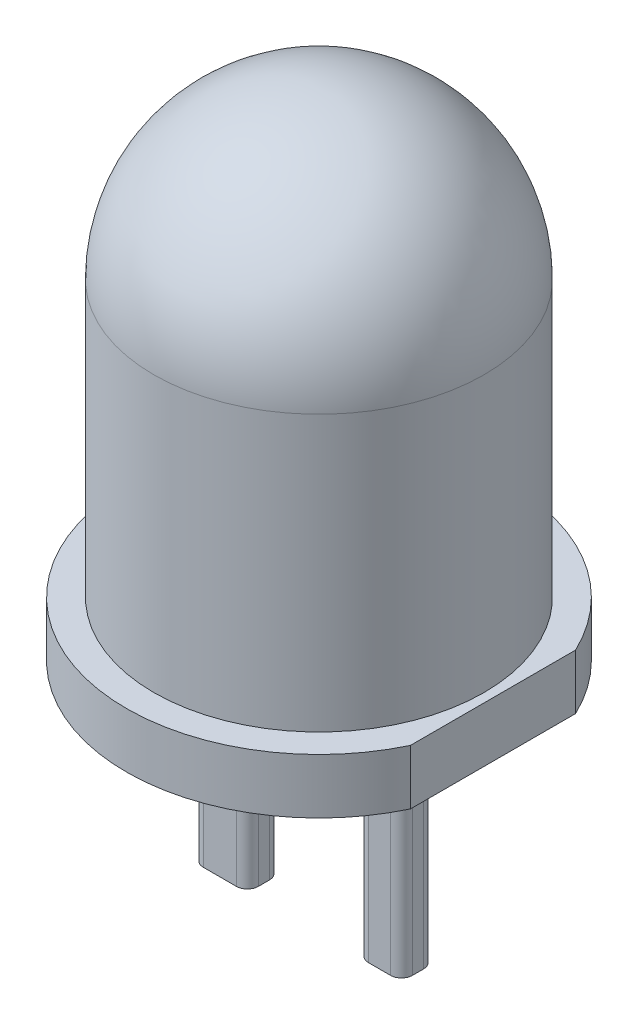
ISO-10303-21;
HEADER;
FILE_DESCRIPTION(('STEP AP214'),'2;1');
FILE_NAME('part.step','',(''),(''),'','','');
FILE_SCHEMA(('AUTOMOTIVE_DESIGN { 1 0 10303 214 1 1 1 1 }'));
ENDSEC;
DATA;
#1=APPLICATION_CONTEXT('core data for automotive mechanical design processes');
#2=APPLICATION_PROTOCOL_DEFINITION('international standard','automotive_design',2000,#1);
#3=PRODUCT_CONTEXT('',#1,'mechanical');
#4=PRODUCT('Part','Part','',(#3));
#5=PRODUCT_RELATED_PRODUCT_CATEGORY('part','',(#4));
#6=PRODUCT_DEFINITION_FORMATION('','',#4);
#7=PRODUCT_DEFINITION_CONTEXT('part definition',#1,'design');
#8=PRODUCT_DEFINITION('design','',#6,#7);
#9=PRODUCT_DEFINITION_SHAPE('','',#8);
#10=(LENGTH_UNIT() NAMED_UNIT(*) SI_UNIT(.MILLI.,.METRE.));
#11=(NAMED_UNIT(*) PLANE_ANGLE_UNIT() SI_UNIT($,.RADIAN.));
#12=(NAMED_UNIT(*) SI_UNIT($,.STERADIAN.) SOLID_ANGLE_UNIT());
#13=UNCERTAINTY_MEASURE_WITH_UNIT(LENGTH_MEASURE(1.E-05),#10,'distance_accuracy_value','');
#14=(GEOMETRIC_REPRESENTATION_CONTEXT(3) GLOBAL_UNCERTAINTY_ASSIGNED_CONTEXT((#13)) GLOBAL_UNIT_ASSIGNED_CONTEXT((#10,
#11,#12)) REPRESENTATION_CONTEXT('',''));
#15=CARTESIAN_POINT('',(0.,0.,0.));
#16=DIRECTION('',(0.,0.,1.));
#17=DIRECTION('',(1.,0.,0.));
#18=AXIS2_PLACEMENT_3D('',#15,#16,#17);
#19=CARTESIAN_POINT('',(0.,0.,0.));
#20=DIRECTION('',(0.,1.,0.));
#21=DIRECTION('',(0.,0.,1.));
#22=AXIS2_PLACEMENT_3D('',#19,#20,#21);
#23=PLANE('',#22);
#24=CARTESIAN_POINT('',(0.8,0.,0.05));
#25=DIRECTION('',(0.,-1.,0.));
#26=DIRECTION('',(0.,0.,1.));
#27=AXIS2_PLACEMENT_3D('',#24,#25,#26);
#28=CIRCLE('',#27,0.1);
#29=CARTESIAN_POINT('',(0.9,0.,0.0499999999999993));
#30=VERTEX_POINT('',#29);
#31=CARTESIAN_POINT('',(0.799999999999999,0.,0.15));
#32=VERTEX_POINT('',#31);
#33=EDGE_CURVE('E181',#30,#32,#28,.T.);
#34=ORIENTED_EDGE('',*,*,#33,.F.);
#35=DIRECTION('',(0.,0.,1.));
#36=VECTOR('',#35,1.);
#37=CARTESIAN_POINT('',(0.9,0.,0.0499999999999993));
#38=LINE('',#37,#36);
#39=CARTESIAN_POINT('',(0.9,0.,-0.0499999999999993));
#40=VERTEX_POINT('',#39);
#41=EDGE_CURVE('E194',#40,#30,#38,.T.);
#42=ORIENTED_EDGE('',*,*,#41,.F.);
#43=CARTESIAN_POINT('',(0.8,0.,-0.05));
#44=DIRECTION('',(0.,-1.,0.));
#45=DIRECTION('',(0.,0.,-1.));
#46=AXIS2_PLACEMENT_3D('',#43,#44,#45);
#47=CIRCLE('',#46,0.1);
#48=CARTESIAN_POINT('',(0.799999999999999,0.,-0.15));
#49=VERTEX_POINT('',#48);
#50=EDGE_CURVE('E223',#49,#40,#47,.T.);
#51=ORIENTED_EDGE('',*,*,#50,.F.);
#52=DIRECTION('',(1.,0.,0.));
#53=VECTOR('',#52,1.);
#54=CARTESIAN_POINT('',(0.600000000000001,0.,-0.15));
#55=LINE('',#54,#53);
#56=CARTESIAN_POINT('',(0.600000000000001,0.,-0.15));
#57=VERTEX_POINT('',#56);
#58=EDGE_CURVE('E220',#57,#49,#55,.T.);
#59=ORIENTED_EDGE('',*,*,#58,.F.);
#60=CARTESIAN_POINT('',(0.6,0.,-0.05));
#61=DIRECTION('',(0.,-1.,0.));
#62=DIRECTION('',(0.,0.,-1.));
#63=AXIS2_PLACEMENT_3D('',#60,#61,#62);
#64=CIRCLE('',#63,0.1);
#65=CARTESIAN_POINT('',(0.5,0.,-0.0499999999999993));
#66=VERTEX_POINT('',#65);
#67=EDGE_CURVE('E217',#66,#57,#64,.T.);
#68=ORIENTED_EDGE('',*,*,#67,.F.);
#69=DIRECTION('',(0.,0.,-1.));
#70=VECTOR('',#69,1.);
#71=CARTESIAN_POINT('',(0.5,0.,0.0499999999999993));
#72=LINE('',#71,#70);
#73=CARTESIAN_POINT('',(0.5,0.,0.0499999999999993));
#74=VERTEX_POINT('',#73);
#75=EDGE_CURVE('E214',#74,#66,#72,.T.);
#76=ORIENTED_EDGE('',*,*,#75,.F.);
#77=CARTESIAN_POINT('',(0.6,0.,0.05));
#78=DIRECTION('',(0.,-1.,0.));
#79=DIRECTION('',(0.,0.,-1.));
#80=AXIS2_PLACEMENT_3D('',#77,#78,#79);
#81=CIRCLE('',#80,0.1);
#82=CARTESIAN_POINT('',(0.6,0.,0.15));
#83=VERTEX_POINT('',#82);
#84=EDGE_CURVE('E211',#83,#74,#81,.T.);
#85=ORIENTED_EDGE('',*,*,#84,.F.);
#86=DIRECTION('',(-1.,0.,0.));
#87=VECTOR('',#86,1.);
#88=CARTESIAN_POINT('',(0.600000000000001,0.,0.15));
#89=LINE('',#88,#87);
#90=EDGE_CURVE('E184',#32,#83,#89,.T.);
#91=ORIENTED_EDGE('',*,*,#90,.F.);
#92=EDGE_LOOP('',(#34,#42,#51,#59,#68,#76,#85,#91));
#93=FACE_BOUND('',#92,.T.);
#94=CARTESIAN_POINT('',(0.,0.,0.));
#95=DIRECTION('',(0.,-1.,0.));
#96=DIRECTION('',(0.,0.,-1.));
#97=AXIS2_PLACEMENT_3D('',#94,#95,#96);
#98=CIRCLE('',#97,1.75);
#99=CARTESIAN_POINT('',(1.58113883008419,0.,0.75));
#100=VERTEX_POINT('',#99);
#101=CARTESIAN_POINT('',(1.58113883008419,0.,-0.75));
#102=VERTEX_POINT('',#101);
#103=EDGE_CURVE('E43',#100,#102,#98,.T.);
#104=ORIENTED_EDGE('',*,*,#103,.T.);
#105=DIRECTION('',(0.,0.,-1.));
#106=VECTOR('',#105,1.);
#107=CARTESIAN_POINT('',(1.58113883008419,0.,-0.75));
#108=LINE('',#107,#106);
#109=EDGE_CURVE('E251',#100,#102,#108,.T.);
#110=ORIENTED_EDGE('',*,*,#109,.F.);
#111=EDGE_LOOP('',(#104,#110));
#112=FACE_BOUND('',#111,.T.);
#113=CARTESIAN_POINT('',(-0.6,0.,-0.05));
#114=DIRECTION('',(0.,-1.,0.));
#115=DIRECTION('',(0.,0.,-1.));
#116=AXIS2_PLACEMENT_3D('',#113,#114,#115);
#117=CIRCLE('',#116,0.1);
#118=CARTESIAN_POINT('',(-0.600000000000001,0.,-0.15));
#119=VERTEX_POINT('',#118);
#120=CARTESIAN_POINT('',(-0.5,0.,-0.0499999999999993));
#121=VERTEX_POINT('',#120);
#122=EDGE_CURVE('E180',#119,#121,#117,.T.);
#123=ORIENTED_EDGE('',*,*,#122,.F.);
#124=DIRECTION('',(1.,0.,0.));
#125=VECTOR('',#124,1.);
#126=CARTESIAN_POINT('',(-0.899999999999999,0.,-0.15));
#127=LINE('',#126,#125);
#128=CARTESIAN_POINT('',(-0.899999999999999,0.,-0.15));
#129=VERTEX_POINT('',#128);
#130=EDGE_CURVE('E177',#129,#119,#127,.T.);
#131=ORIENTED_EDGE('',*,*,#130,.F.);
#132=CARTESIAN_POINT('',(-0.9,0.,-0.05));
#133=DIRECTION('',(0.,-1.,0.));
#134=DIRECTION('',(0.,0.,-1.));
#135=AXIS2_PLACEMENT_3D('',#132,#133,#134);
#136=CIRCLE('',#135,0.1);
#137=CARTESIAN_POINT('',(-1.,0.,-0.0499999999999993));
#138=VERTEX_POINT('',#137);
#139=EDGE_CURVE('E536',#138,#129,#136,.T.);
#140=ORIENTED_EDGE('',*,*,#139,.F.);
#141=DIRECTION('',(0.,0.,-1.));
#142=VECTOR('',#141,1.);
#143=CARTESIAN_POINT('',(-1.,0.,0.0499999999999993));
#144=LINE('',#143,#142);
#145=CARTESIAN_POINT('',(-1.,0.,0.0499999999999993));
#146=VERTEX_POINT('',#145);
#147=EDGE_CURVE('E567',#146,#138,#144,.T.);
#148=ORIENTED_EDGE('',*,*,#147,.F.);
#149=CARTESIAN_POINT('',(-0.9,0.,0.05));
#150=DIRECTION('',(0.,-1.,0.));
#151=DIRECTION('',(0.,0.,-1.));
#152=AXIS2_PLACEMENT_3D('',#149,#150,#151);
#153=CIRCLE('',#152,0.1);
#154=CARTESIAN_POINT('',(-0.9,0.,0.15));
#155=VERTEX_POINT('',#154);
#156=EDGE_CURVE('E560',#155,#146,#153,.T.);
#157=ORIENTED_EDGE('',*,*,#156,.F.);
#158=DIRECTION('',(-1.,0.,0.));
#159=VECTOR('',#158,1.);
#160=CARTESIAN_POINT('',(-0.899999999999999,0.,0.15));
#161=LINE('',#160,#159);
#162=CARTESIAN_POINT('',(-0.600000000000001,0.,0.15));
#163=VERTEX_POINT('',#162);
#164=EDGE_CURVE('E557',#163,#155,#161,.T.);
#165=ORIENTED_EDGE('',*,*,#164,.F.);
#166=CARTESIAN_POINT('',(-0.6,0.,0.05));
#167=DIRECTION('',(0.,-1.,0.));
#168=DIRECTION('',(0.,0.,1.));
#169=AXIS2_PLACEMENT_3D('',#166,#167,#168);
#170=CIRCLE('',#169,0.1);
#171=CARTESIAN_POINT('',(-0.5,0.,0.0499999999999993));
#172=VERTEX_POINT('',#171);
#173=EDGE_CURVE('E55',#172,#163,#170,.T.);
#174=ORIENTED_EDGE('',*,*,#173,.F.);
#175=DIRECTION('',(0.,0.,1.));
#176=VECTOR('',#175,1.);
#177=CARTESIAN_POINT('',(-0.5,0.,0.0499999999999993));
#178=LINE('',#177,#176);
#179=EDGE_CURVE('E50',#121,#172,#178,.T.);
#180=ORIENTED_EDGE('',*,*,#179,.F.);
#181=EDGE_LOOP('',(#123,#131,#140,#148,#157,#165,#174,#180));
#182=FACE_BOUND('',#181,.T.);
#183=ADVANCED_FACE('F36',(#93,#112,#182),#23,.F.);
#184=CARTESIAN_POINT('',(0.,0.,0.));
#185=DIRECTION('',(0.,-1.,0.));
#186=DIRECTION('',(0.,0.,-1.));
#187=AXIS2_PLACEMENT_3D('',#184,#185,#186);
#188=CYLINDRICAL_SURFACE('',#187,1.75);
#189=CARTESIAN_POINT('',(0.,0.5,0.));
#190=DIRECTION('',(0.,-1.,0.));
#191=DIRECTION('',(0.,0.,-1.));
#192=AXIS2_PLACEMENT_3D('',#189,#190,#191);
#193=CIRCLE('',#192,1.75);
#194=CARTESIAN_POINT('',(1.58113883008419,0.5,0.75));
#195=VERTEX_POINT('',#194);
#196=CARTESIAN_POINT('',(1.58113883008419,0.5,-0.75));
#197=VERTEX_POINT('',#196);
#198=EDGE_CURVE('E264',#195,#197,#193,.T.);
#199=ORIENTED_EDGE('',*,*,#198,.T.);
#200=DIRECTION('',(0.,-1.,0.));
#201=VECTOR('',#200,1.);
#202=CARTESIAN_POINT('',(1.58113883008419,1.,-0.75));
#203=LINE('',#202,#201);
#204=EDGE_CURVE('E254',#197,#102,#203,.T.);
#205=ORIENTED_EDGE('',*,*,#204,.T.);
#206=ORIENTED_EDGE('',*,*,#103,.F.);
#207=DIRECTION('',(0.,-1.,0.));
#208=VECTOR('',#207,1.);
#209=CARTESIAN_POINT('',(1.58113883008419,1.,0.75));
#210=LINE('',#209,#208);
#211=EDGE_CURVE('E253',#195,#100,#210,.T.);
#212=ORIENTED_EDGE('',*,*,#211,.F.);
#213=EDGE_LOOP('',(#199,#205,#206,#212));
#214=FACE_BOUND('',#213,.T.);
#215=ADVANCED_FACE('F272',(#214),#188,.T.);
#216=CARTESIAN_POINT('',(-1.75,0.5,0.));
#217=DIRECTION('',(0.,-1.,0.));
#218=DIRECTION('',(0.,0.,-1.));
#219=AXIS2_PLACEMENT_3D('',#216,#217,#218);
#220=PLANE('',#219);
#221=ORIENTED_EDGE('',*,*,#198,.F.);
#222=DIRECTION('',(0.,0.,-1.));
#223=VECTOR('',#222,1.);
#224=CARTESIAN_POINT('',(1.58113883008419,0.5,0.));
#225=LINE('',#224,#223);
#226=EDGE_CURVE('E11',#195,#197,#225,.T.);
#227=ORIENTED_EDGE('',*,*,#226,.T.);
#228=EDGE_LOOP('',(#221,#227));
#229=FACE_BOUND('',#228,.T.);
#230=CARTESIAN_POINT('',(0.,0.5,0.));
#231=DIRECTION('',(0.,-1.,0.));
#232=DIRECTION('',(0.,0.,-1.));
#233=AXIS2_PLACEMENT_3D('',#230,#231,#232);
#234=CIRCLE('',#233,1.5);
#235=CARTESIAN_POINT('',(0.,0.5,-1.5));
#236=VERTEX_POINT('',#235);
#237=EDGE_CURVE('E261',#236,#236,#234,.T.);
#238=ORIENTED_EDGE('',*,*,#237,.T.);
#239=EDGE_LOOP('',(#238));
#240=FACE_BOUND('',#239,.T.);
#241=ADVANCED_FACE('F277',(#229,#240),#220,.F.);
#242=CARTESIAN_POINT('',(0.,0.,0.));
#243=DIRECTION('',(0.,-1.,0.));
#244=DIRECTION('',(0.,0.,-1.));
#245=AXIS2_PLACEMENT_3D('',#242,#243,#244);
#246=CYLINDRICAL_SURFACE('',#245,1.5);
#247=ORIENTED_EDGE('',*,*,#237,.F.);
#248=EDGE_LOOP('',(#247));
#249=FACE_BOUND('',#248,.T.);
#250=CARTESIAN_POINT('',(0.,3.00000000000001,0.));
#251=DIRECTION('',(0.,-1.,0.));
#252=DIRECTION('',(0.,0.,-1.));
#253=AXIS2_PLACEMENT_3D('',#250,#251,#252);
#254=CIRCLE('',#253,1.5);
#255=CARTESIAN_POINT('',(0.,3.00000000000001,-1.5));
#256=VERTEX_POINT('',#255);
#257=EDGE_CURVE('E257',#256,#256,#254,.T.);
#258=ORIENTED_EDGE('',*,*,#257,.T.);
#259=EDGE_LOOP('',(#258));
#260=FACE_BOUND('',#259,.T.);
#261=ADVANCED_FACE('F280',(#249,#260),#246,.T.);
#262=CARTESIAN_POINT('',(0.,3.00000000000001,0.));
#263=DIRECTION('',(0.,-1.,0.));
#264=DIRECTION('',(1.,0.,0.));
#265=AXIS2_PLACEMENT_3D('',#262,#263,#264);
#266=SPHERICAL_SURFACE('',#265,1.49999999999999);
#267=ORIENTED_EDGE('',*,*,#257,.F.);
#268=EDGE_LOOP('',(#267));
#269=FACE_BOUND('',#268,.T.);
#270=ADVANCED_FACE('F286',(#269),#266,.T.);
#271=CARTESIAN_POINT('',(1.58113883008419,1.,-0.75));
#272=DIRECTION('',(-1.,0.,0.));
#273=DIRECTION('',(0.,0.,1.));
#274=AXIS2_PLACEMENT_3D('',#271,#272,#273);
#275=PLANE('',#274);
#276=ORIENTED_EDGE('',*,*,#211,.T.);
#277=ORIENTED_EDGE('',*,*,#109,.T.);
#278=ORIENTED_EDGE('',*,*,#204,.F.);
#279=ORIENTED_EDGE('',*,*,#226,.F.);
#280=EDGE_LOOP('',(#276,#277,#278,#279));
#281=FACE_BOUND('',#280,.T.);
#282=ADVANCED_FACE('F275',(#281),#275,.F.);
#283=CARTESIAN_POINT('',(0.8,-2.,0.05));
#284=DIRECTION('',(0.,1.,0.));
#285=DIRECTION('',(0.,0.,1.));
#286=AXIS2_PLACEMENT_3D('',#283,#284,#285);
#287=CYLINDRICAL_SURFACE('',#286,0.1);
#288=ORIENTED_EDGE('',*,*,#33,.T.);
#289=DIRECTION('',(0.,1.,0.));
#290=VECTOR('',#289,1.);
#291=CARTESIAN_POINT('',(0.799999999999999,-2.,0.15));
#292=LINE('',#291,#290);
#293=CARTESIAN_POINT('',(0.799999999999999,-2.,0.15));
#294=VERTEX_POINT('',#293);
#295=EDGE_CURVE('E248',#294,#32,#292,.T.);
#296=ORIENTED_EDGE('',*,*,#295,.F.);
#297=CARTESIAN_POINT('',(0.8,-2.,0.05));
#298=DIRECTION('',(0.,-1.,0.));
#299=DIRECTION('',(0.,0.,1.));
#300=AXIS2_PLACEMENT_3D('',#297,#298,#299);
#301=CIRCLE('',#300,0.1);
#302=CARTESIAN_POINT('',(0.9,-2.,0.0499999999999993));
#303=VERTEX_POINT('',#302);
#304=EDGE_CURVE('E190',#303,#294,#301,.T.);
#305=ORIENTED_EDGE('',*,*,#304,.F.);
#306=DIRECTION('',(0.,1.,0.));
#307=VECTOR('',#306,1.);
#308=CARTESIAN_POINT('',(0.9,-2.,0.0499999999999993));
#309=LINE('',#308,#307);
#310=EDGE_CURVE('E207',#303,#30,#309,.T.);
#311=ORIENTED_EDGE('',*,*,#310,.T.);
#312=EDGE_LOOP('',(#288,#296,#305,#311));
#313=FACE_BOUND('',#312,.T.);
#314=ADVANCED_FACE('F295',(#313),#287,.T.);
#315=CARTESIAN_POINT('',(0.600000000000001,-2.,0.15));
#316=DIRECTION('',(0.,0.,-1.));
#317=DIRECTION('',(-1.,0.,0.));
#318=AXIS2_PLACEMENT_3D('',#315,#316,#317);
#319=PLANE('',#318);
#320=ORIENTED_EDGE('',*,*,#90,.T.);
#321=DIRECTION('',(0.,1.,0.));
#322=VECTOR('',#321,1.);
#323=CARTESIAN_POINT('',(0.600000000000001,-2.,0.15));
#324=LINE('',#323,#322);
#325=CARTESIAN_POINT('',(0.600000000000001,-2.,0.15));
#326=VERTEX_POINT('',#325);
#327=EDGE_CURVE('E245',#326,#83,#324,.T.);
#328=ORIENTED_EDGE('',*,*,#327,.F.);
#329=DIRECTION('',(-1.,0.,0.));
#330=VECTOR('',#329,1.);
#331=CARTESIAN_POINT('',(0.600000000000001,-2.,0.15));
#332=LINE('',#331,#330);
#333=EDGE_CURVE('E193',#294,#326,#332,.T.);
#334=ORIENTED_EDGE('',*,*,#333,.F.);
#335=ORIENTED_EDGE('',*,*,#295,.T.);
#336=EDGE_LOOP('',(#320,#328,#334,#335));
#337=FACE_BOUND('',#336,.T.);
#338=ADVANCED_FACE('F333',(#337),#319,.F.);
#339=CARTESIAN_POINT('',(0.6,-2.,0.05));
#340=DIRECTION('',(0.,1.,0.));
#341=DIRECTION('',(0.,0.,1.));
#342=AXIS2_PLACEMENT_3D('',#339,#340,#341);
#343=CYLINDRICAL_SURFACE('',#342,0.1);
#344=ORIENTED_EDGE('',*,*,#84,.T.);
#345=DIRECTION('',(0.,1.,0.));
#346=VECTOR('',#345,1.);
#347=CARTESIAN_POINT('',(0.5,-2.,0.0499999999999993));
#348=LINE('',#347,#346);
#349=CARTESIAN_POINT('',(0.5,-2.,0.0499999999999993));
#350=VERTEX_POINT('',#349);
#351=EDGE_CURVE('E242',#350,#74,#348,.T.);
#352=ORIENTED_EDGE('',*,*,#351,.F.);
#353=CARTESIAN_POINT('',(0.6,-2.,0.05));
#354=DIRECTION('',(0.,-1.,0.));
#355=DIRECTION('',(0.,0.,-1.));
#356=AXIS2_PLACEMENT_3D('',#353,#354,#355);
#357=CIRCLE('',#356,0.1);
#358=EDGE_CURVE('E196',#326,#350,#357,.T.);
#359=ORIENTED_EDGE('',*,*,#358,.F.);
#360=ORIENTED_EDGE('',*,*,#327,.T.);
#361=EDGE_LOOP('',(#344,#352,#359,#360));
#362=FACE_BOUND('',#361,.T.);
#363=ADVANCED_FACE('F331',(#362),#343,.T.);
#364=CARTESIAN_POINT('',(0.5,-2.,0.0499999999999993));
#365=DIRECTION('',(1.,0.,0.));
#366=DIRECTION('',(0.,0.,-1.));
#367=AXIS2_PLACEMENT_3D('',#364,#365,#366);
#368=PLANE('',#367);
#369=ORIENTED_EDGE('',*,*,#75,.T.);
#370=DIRECTION('',(0.,1.,0.));
#371=VECTOR('',#370,1.);
#372=CARTESIAN_POINT('',(0.5,-2.,-0.0499999999999993));
#373=LINE('',#372,#371);
#374=CARTESIAN_POINT('',(0.5,-2.,-0.0499999999999993));
#375=VERTEX_POINT('',#374);
#376=EDGE_CURVE('E239',#375,#66,#373,.T.);
#377=ORIENTED_EDGE('',*,*,#376,.F.);
#378=DIRECTION('',(0.,0.,-1.));
#379=VECTOR('',#378,1.);
#380=CARTESIAN_POINT('',(0.5,-2.,0.0499999999999993));
#381=LINE('',#380,#379);
#382=EDGE_CURVE('E198',#350,#375,#381,.T.);
#383=ORIENTED_EDGE('',*,*,#382,.F.);
#384=ORIENTED_EDGE('',*,*,#351,.T.);
#385=EDGE_LOOP('',(#369,#377,#383,#384));
#386=FACE_BOUND('',#385,.T.);
#387=ADVANCED_FACE('F326',(#386),#368,.F.);
#388=CARTESIAN_POINT('',(0.6,-2.,-0.05));
#389=DIRECTION('',(0.,1.,0.));
#390=DIRECTION('',(0.,0.,1.));
#391=AXIS2_PLACEMENT_3D('',#388,#389,#390);
#392=CYLINDRICAL_SURFACE('',#391,0.1);
#393=ORIENTED_EDGE('',*,*,#67,.T.);
#394=DIRECTION('',(0.,1.,0.));
#395=VECTOR('',#394,1.);
#396=CARTESIAN_POINT('',(0.600000000000001,-2.,-0.15));
#397=LINE('',#396,#395);
#398=CARTESIAN_POINT('',(0.600000000000001,-2.,-0.15));
#399=VERTEX_POINT('',#398);
#400=EDGE_CURVE('E236',#399,#57,#397,.T.);
#401=ORIENTED_EDGE('',*,*,#400,.F.);
#402=CARTESIAN_POINT('',(0.6,-2.,-0.05));
#403=DIRECTION('',(0.,-1.,0.));
#404=DIRECTION('',(0.,0.,-1.));
#405=AXIS2_PLACEMENT_3D('',#402,#403,#404);
#406=CIRCLE('',#405,0.1);
#407=EDGE_CURVE('E200',#375,#399,#406,.T.);
#408=ORIENTED_EDGE('',*,*,#407,.F.);
#409=ORIENTED_EDGE('',*,*,#376,.T.);
#410=EDGE_LOOP('',(#393,#401,#408,#409));
#411=FACE_BOUND('',#410,.T.);
#412=ADVANCED_FACE('F323',(#411),#392,.T.);
#413=CARTESIAN_POINT('',(0.600000000000001,-2.,-0.15));
#414=DIRECTION('',(0.,0.,1.));
#415=DIRECTION('',(1.,0.,0.));
#416=AXIS2_PLACEMENT_3D('',#413,#414,#415);
#417=PLANE('',#416);
#418=ORIENTED_EDGE('',*,*,#58,.T.);
#419=DIRECTION('',(0.,1.,0.));
#420=VECTOR('',#419,1.);
#421=CARTESIAN_POINT('',(0.799999999999999,-2.,-0.15));
#422=LINE('',#421,#420);
#423=CARTESIAN_POINT('',(0.799999999999999,-2.,-0.15));
#424=VERTEX_POINT('',#423);
#425=EDGE_CURVE('E233',#424,#49,#422,.T.);
#426=ORIENTED_EDGE('',*,*,#425,.F.);
#427=DIRECTION('',(1.,0.,0.));
#428=VECTOR('',#427,1.);
#429=CARTESIAN_POINT('',(0.600000000000001,-2.,-0.15));
#430=LINE('',#429,#428);
#431=EDGE_CURVE('E202',#399,#424,#430,.T.);
#432=ORIENTED_EDGE('',*,*,#431,.F.);
#433=ORIENTED_EDGE('',*,*,#400,.T.);
#434=EDGE_LOOP('',(#418,#426,#432,#433));
#435=FACE_BOUND('',#434,.T.);
#436=ADVANCED_FACE('F319',(#435),#417,.F.);
#437=CARTESIAN_POINT('',(0.8,-2.,-0.05));
#438=DIRECTION('',(0.,1.,0.));
#439=DIRECTION('',(0.,0.,1.));
#440=AXIS2_PLACEMENT_3D('',#437,#438,#439);
#441=CYLINDRICAL_SURFACE('',#440,0.1);
#442=ORIENTED_EDGE('',*,*,#50,.T.);
#443=DIRECTION('',(0.,1.,0.));
#444=VECTOR('',#443,1.);
#445=CARTESIAN_POINT('',(0.9,-2.,-0.0499999999999993));
#446=LINE('',#445,#444);
#447=CARTESIAN_POINT('',(0.9,-2.,-0.0499999999999993));
#448=VERTEX_POINT('',#447);
#449=EDGE_CURVE('E230',#448,#40,#446,.T.);
#450=ORIENTED_EDGE('',*,*,#449,.F.);
#451=CARTESIAN_POINT('',(0.8,-2.,-0.05));
#452=DIRECTION('',(0.,-1.,0.));
#453=DIRECTION('',(0.,0.,-1.));
#454=AXIS2_PLACEMENT_3D('',#451,#452,#453);
#455=CIRCLE('',#454,0.1);
#456=EDGE_CURVE('E204',#424,#448,#455,.T.);
#457=ORIENTED_EDGE('',*,*,#456,.F.);
#458=ORIENTED_EDGE('',*,*,#425,.T.);
#459=EDGE_LOOP('',(#442,#450,#457,#458));
#460=FACE_BOUND('',#459,.T.);
#461=ADVANCED_FACE('F317',(#460),#441,.T.);
#462=CARTESIAN_POINT('',(0.9,-2.,0.0499999999999993));
#463=DIRECTION('',(-1.,0.,0.));
#464=DIRECTION('',(0.,0.,1.));
#465=AXIS2_PLACEMENT_3D('',#462,#463,#464);
#466=PLANE('',#465);
#467=ORIENTED_EDGE('',*,*,#41,.T.);
#468=ORIENTED_EDGE('',*,*,#310,.F.);
#469=DIRECTION('',(0.,0.,1.));
#470=VECTOR('',#469,1.);
#471=CARTESIAN_POINT('',(0.9,-2.,0.0499999999999993));
#472=LINE('',#471,#470);
#473=EDGE_CURVE('E206',#448,#303,#472,.T.);
#474=ORIENTED_EDGE('',*,*,#473,.F.);
#475=ORIENTED_EDGE('',*,*,#449,.T.);
#476=EDGE_LOOP('',(#467,#468,#474,#475));
#477=FACE_BOUND('',#476,.T.);
#478=ADVANCED_FACE('F306',(#477),#466,.F.);
#479=CARTESIAN_POINT('',(0.8,-2.,0.05));
#480=DIRECTION('',(0.,1.,0.));
#481=DIRECTION('',(0.,0.,1.));
#482=AXIS2_PLACEMENT_3D('',#479,#480,#481);
#483=PLANE('',#482);
#484=ORIENTED_EDGE('',*,*,#304,.T.);
#485=ORIENTED_EDGE('',*,*,#333,.T.);
#486=ORIENTED_EDGE('',*,*,#358,.T.);
#487=ORIENTED_EDGE('',*,*,#382,.T.);
#488=ORIENTED_EDGE('',*,*,#407,.T.);
#489=ORIENTED_EDGE('',*,*,#431,.T.);
#490=ORIENTED_EDGE('',*,*,#456,.T.);
#491=ORIENTED_EDGE('',*,*,#473,.T.);
#492=EDGE_LOOP('',(#484,#485,#486,#487,#488,#489,#490,#491));
#493=FACE_BOUND('',#492,.T.);
#494=ADVANCED_FACE('F311',(#493),#483,.F.);
#495=CARTESIAN_POINT('',(-0.6,-2.,-0.05));
#496=DIRECTION('',(0.,1.,0.));
#497=DIRECTION('',(0.,0.,1.));
#498=AXIS2_PLACEMENT_3D('',#495,#496,#497);
#499=CYLINDRICAL_SURFACE('',#498,0.1);
#500=ORIENTED_EDGE('',*,*,#122,.T.);
#501=DIRECTION('',(0.,1.,0.));
#502=VECTOR('',#501,1.);
#503=CARTESIAN_POINT('',(-0.5,-2.,-0.0499999999999993));
#504=LINE('',#503,#502);
#505=CARTESIAN_POINT('',(-0.5,-2.,-0.0499999999999993));
#506=VERTEX_POINT('',#505);
#507=EDGE_CURVE('E161',#506,#121,#504,.T.);
#508=ORIENTED_EDGE('',*,*,#507,.F.);
#509=CARTESIAN_POINT('',(-0.6,-2.,-0.05));
#510=DIRECTION('',(0.,-1.,0.));
#511=DIRECTION('',(0.,0.,-1.));
#512=AXIS2_PLACEMENT_3D('',#509,#510,#511);
#513=CIRCLE('',#512,0.1);
#514=CARTESIAN_POINT('',(-0.600000000000001,-2.,-0.15));
#515=VERTEX_POINT('',#514);
#516=EDGE_CURVE('E168',#515,#506,#513,.T.);
#517=ORIENTED_EDGE('',*,*,#516,.F.);
#518=DIRECTION('',(0.,1.,0.));
#519=VECTOR('',#518,1.);
#520=CARTESIAN_POINT('',(-0.600000000000001,-2.,-0.15));
#521=LINE('',#520,#519);
#522=EDGE_CURVE('E532',#515,#119,#521,.T.);
#523=ORIENTED_EDGE('',*,*,#522,.T.);
#524=EDGE_LOOP('',(#500,#508,#517,#523));
#525=FACE_BOUND('',#524,.T.);
#526=ADVANCED_FACE('F179',(#525),#499,.T.);
#527=CARTESIAN_POINT('',(-0.5,-2.,0.0499999999999993));
#528=DIRECTION('',(-1.,0.,0.));
#529=DIRECTION('',(0.,0.,1.));
#530=AXIS2_PLACEMENT_3D('',#527,#528,#529);
#531=PLANE('',#530);
#532=ORIENTED_EDGE('',*,*,#179,.T.);
#533=DIRECTION('',(0.,1.,0.));
#534=VECTOR('',#533,1.);
#535=CARTESIAN_POINT('',(-0.5,-2.,0.0499999999999993));
#536=LINE('',#535,#534);
#537=CARTESIAN_POINT('',(-0.5,-2.,0.0499999999999993));
#538=VERTEX_POINT('',#537);
#539=EDGE_CURVE('E164',#538,#172,#536,.T.);
#540=ORIENTED_EDGE('',*,*,#539,.F.);
#541=DIRECTION('',(0.,0.,1.));
#542=VECTOR('',#541,1.);
#543=CARTESIAN_POINT('',(-0.5,-2.,0.0499999999999993));
#544=LINE('',#543,#542);
#545=EDGE_CURVE('E157',#506,#538,#544,.T.);
#546=ORIENTED_EDGE('',*,*,#545,.F.);
#547=ORIENTED_EDGE('',*,*,#507,.T.);
#548=EDGE_LOOP('',(#532,#540,#546,#547));
#549=FACE_BOUND('',#548,.T.);
#550=ADVANCED_FACE('F159',(#549),#531,.F.);
#551=CARTESIAN_POINT('',(-0.6,-2.,0.05));
#552=DIRECTION('',(0.,1.,0.));
#553=DIRECTION('',(0.,0.,1.));
#554=AXIS2_PLACEMENT_3D('',#551,#552,#553);
#555=CYLINDRICAL_SURFACE('',#554,0.1);
#556=ORIENTED_EDGE('',*,*,#173,.T.);
#557=DIRECTION('',(0.,1.,0.));
#558=VECTOR('',#557,1.);
#559=CARTESIAN_POINT('',(-0.600000000000001,-2.,0.15));
#560=LINE('',#559,#558);
#561=CARTESIAN_POINT('',(-0.600000000000001,-2.,0.15));
#562=VERTEX_POINT('',#561);
#563=EDGE_CURVE('E186',#562,#163,#560,.T.);
#564=ORIENTED_EDGE('',*,*,#563,.F.);
#565=CARTESIAN_POINT('',(-0.6,-2.,0.05));
#566=DIRECTION('',(0.,-1.,0.));
#567=DIRECTION('',(0.,0.,1.));
#568=AXIS2_PLACEMENT_3D('',#565,#566,#567);
#569=CIRCLE('',#568,0.1);
#570=EDGE_CURVE('E167',#538,#562,#569,.T.);
#571=ORIENTED_EDGE('',*,*,#570,.F.);
#572=ORIENTED_EDGE('',*,*,#539,.T.);
#573=EDGE_LOOP('',(#556,#564,#571,#572));
#574=FACE_BOUND('',#573,.T.);
#575=ADVANCED_FACE('F359',(#574),#555,.T.);
#576=CARTESIAN_POINT('',(-0.899999999999999,-2.,0.15));
#577=DIRECTION('',(0.,0.,-1.));
#578=DIRECTION('',(-1.,0.,0.));
#579=AXIS2_PLACEMENT_3D('',#576,#577,#578);
#580=PLANE('',#579);
#581=ORIENTED_EDGE('',*,*,#164,.T.);
#582=DIRECTION('',(0.,1.,0.));
#583=VECTOR('',#582,1.);
#584=CARTESIAN_POINT('',(-0.899999999999999,-2.,0.15));
#585=LINE('',#584,#583);
#586=CARTESIAN_POINT('',(-0.899999999999999,-2.,0.15));
#587=VERTEX_POINT('',#586);
#588=EDGE_CURVE('E550',#587,#155,#585,.T.);
#589=ORIENTED_EDGE('',*,*,#588,.F.);
#590=DIRECTION('',(-1.,0.,0.));
#591=VECTOR('',#590,1.);
#592=CARTESIAN_POINT('',(-0.899999999999999,-2.,0.15));
#593=LINE('',#592,#591);
#594=EDGE_CURVE('E558',#562,#587,#593,.T.);
#595=ORIENTED_EDGE('',*,*,#594,.F.);
#596=ORIENTED_EDGE('',*,*,#563,.T.);
#597=EDGE_LOOP('',(#581,#589,#595,#596));
#598=FACE_BOUND('',#597,.T.);
#599=ADVANCED_FACE('F362',(#598),#580,.F.);
#600=CARTESIAN_POINT('',(-0.9,-2.,0.05));
#601=DIRECTION('',(0.,1.,0.));
#602=DIRECTION('',(0.,0.,1.));
#603=AXIS2_PLACEMENT_3D('',#600,#601,#602);
#604=CYLINDRICAL_SURFACE('',#603,0.1);
#605=ORIENTED_EDGE('',*,*,#156,.T.);
#606=DIRECTION('',(0.,1.,0.));
#607=VECTOR('',#606,1.);
#608=CARTESIAN_POINT('',(-1.,-2.,0.0499999999999993));
#609=LINE('',#608,#607);
#610=CARTESIAN_POINT('',(-1.,-2.,0.0499999999999993));
#611=VERTEX_POINT('',#610);
#612=EDGE_CURVE('E547',#611,#146,#609,.T.);
#613=ORIENTED_EDGE('',*,*,#612,.F.);
#614=CARTESIAN_POINT('',(-0.9,-2.,0.05));
#615=DIRECTION('',(0.,-1.,0.));
#616=DIRECTION('',(0.,0.,-1.));
#617=AXIS2_PLACEMENT_3D('',#614,#615,#616);
#618=CIRCLE('',#617,0.1);
#619=EDGE_CURVE('E575',#587,#611,#618,.T.);
#620=ORIENTED_EDGE('',*,*,#619,.F.);
#621=ORIENTED_EDGE('',*,*,#588,.T.);
#622=EDGE_LOOP('',(#605,#613,#620,#621));
#623=FACE_BOUND('',#622,.T.);
#624=ADVANCED_FACE('F366',(#623),#604,.T.);
#625=CARTESIAN_POINT('',(-1.,-2.,0.0499999999999993));
#626=DIRECTION('',(1.,0.,0.));
#627=DIRECTION('',(0.,0.,-1.));
#628=AXIS2_PLACEMENT_3D('',#625,#626,#627);
#629=PLANE('',#628);
#630=ORIENTED_EDGE('',*,*,#147,.T.);
#631=DIRECTION('',(0.,1.,0.));
#632=VECTOR('',#631,1.);
#633=CARTESIAN_POINT('',(-1.,-2.,-0.0499999999999993));
#634=LINE('',#633,#632);
#635=CARTESIAN_POINT('',(-1.,-2.,-0.0499999999999993));
#636=VERTEX_POINT('',#635);
#637=EDGE_CURVE('E539',#636,#138,#634,.T.);
#638=ORIENTED_EDGE('',*,*,#637,.F.);
#639=DIRECTION('',(0.,0.,-1.));
#640=VECTOR('',#639,1.);
#641=CARTESIAN_POINT('',(-1.,-2.,0.0499999999999993));
#642=LINE('',#641,#640);
#643=EDGE_CURVE('E573',#611,#636,#642,.T.);
#644=ORIENTED_EDGE('',*,*,#643,.F.);
#645=ORIENTED_EDGE('',*,*,#612,.T.);
#646=EDGE_LOOP('',(#630,#638,#644,#645));
#647=FACE_BOUND('',#646,.T.);
#648=ADVANCED_FACE('F370',(#647),#629,.F.);
#649=CARTESIAN_POINT('',(-0.9,-2.,-0.05));
#650=DIRECTION('',(0.,1.,0.));
#651=DIRECTION('',(0.,0.,1.));
#652=AXIS2_PLACEMENT_3D('',#649,#650,#651);
#653=CYLINDRICAL_SURFACE('',#652,0.1);
#654=ORIENTED_EDGE('',*,*,#139,.T.);
#655=DIRECTION('',(0.,1.,0.));
#656=VECTOR('',#655,1.);
#657=CARTESIAN_POINT('',(-0.899999999999999,-2.,-0.15));
#658=LINE('',#657,#656);
#659=CARTESIAN_POINT('',(-0.899999999999999,-2.,-0.15));
#660=VERTEX_POINT('',#659);
#661=EDGE_CURVE('E534',#660,#129,#658,.T.);
#662=ORIENTED_EDGE('',*,*,#661,.F.);
#663=CARTESIAN_POINT('',(-0.9,-2.,-0.05));
#664=DIRECTION('',(0.,-1.,0.));
#665=DIRECTION('',(0.,0.,-1.));
#666=AXIS2_PLACEMENT_3D('',#663,#664,#665);
#667=CIRCLE('',#666,0.1);
#668=EDGE_CURVE('E541',#636,#660,#667,.T.);
#669=ORIENTED_EDGE('',*,*,#668,.F.);
#670=ORIENTED_EDGE('',*,*,#637,.T.);
#671=EDGE_LOOP('',(#654,#662,#669,#670));
#672=FACE_BOUND('',#671,.T.);
#673=ADVANCED_FACE('F374',(#672),#653,.T.);
#674=CARTESIAN_POINT('',(-0.899999999999999,-2.,-0.15));
#675=DIRECTION('',(0.,0.,1.));
#676=DIRECTION('',(1.,0.,0.));
#677=AXIS2_PLACEMENT_3D('',#674,#675,#676);
#678=PLANE('',#677);
#679=ORIENTED_EDGE('',*,*,#130,.T.);
#680=ORIENTED_EDGE('',*,*,#522,.F.);
#681=DIRECTION('',(1.,0.,0.));
#682=VECTOR('',#681,1.);
#683=CARTESIAN_POINT('',(-0.899999999999999,-2.,-0.15));
#684=LINE('',#683,#682);
#685=EDGE_CURVE('E173',#660,#515,#684,.T.);
#686=ORIENTED_EDGE('',*,*,#685,.F.);
#687=ORIENTED_EDGE('',*,*,#661,.T.);
#688=EDGE_LOOP('',(#679,#680,#686,#687));
#689=FACE_BOUND('',#688,.T.);
#690=ADVANCED_FACE('F378',(#689),#678,.F.);
#691=CARTESIAN_POINT('',(-0.6,-2.,-0.05));
#692=DIRECTION('',(0.,-1.,0.));
#693=DIRECTION('',(0.,0.,-1.));
#694=AXIS2_PLACEMENT_3D('',#691,#692,#693);
#695=PLANE('',#694);
#696=ORIENTED_EDGE('',*,*,#516,.T.);
#697=ORIENTED_EDGE('',*,*,#545,.T.);
#698=ORIENTED_EDGE('',*,*,#570,.T.);
#699=ORIENTED_EDGE('',*,*,#594,.T.);
#700=ORIENTED_EDGE('',*,*,#619,.T.);
#701=ORIENTED_EDGE('',*,*,#643,.T.);
#702=ORIENTED_EDGE('',*,*,#668,.T.);
#703=ORIENTED_EDGE('',*,*,#685,.T.);
#704=EDGE_LOOP('',(#696,#697,#698,#699,#700,#701,#702,#703));
#705=FACE_BOUND('',#704,.T.);
#706=ADVANCED_FACE('F171',(#705),#695,.T.);
#707=CLOSED_SHELL('',(#183,#215,#241,#261,#270,#282,#314,#338,#363,#387,#412,#436,#461,#478,
#494,#526,#550,#575,#599,#624,#648,#673,#690,#706));
#708=MANIFOLD_SOLID_BREP('B2',#707);
#709=ADVANCED_BREP_SHAPE_REPRESENTATION('',(#18,#708),#14);
#710=SHAPE_DEFINITION_REPRESENTATION(#9,#709);
ENDSEC;
END-ISO-10303-21;
